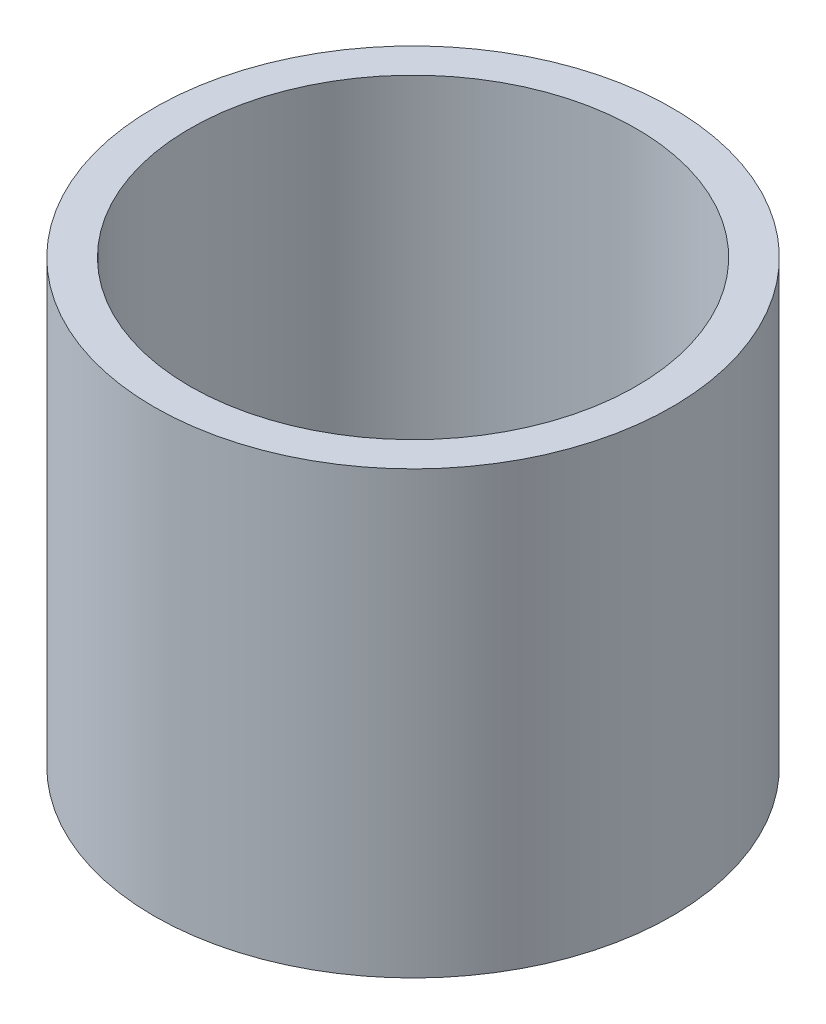
ISO-10303-21;
HEADER;
FILE_DESCRIPTION(('STEP AP214'),'2;1');
FILE_NAME('part.step','',(''),(''),'','','');
FILE_SCHEMA(('AUTOMOTIVE_DESIGN { 1 0 10303 214 1 1 1 1 }'));
ENDSEC;
DATA;
#1=APPLICATION_CONTEXT('core data for automotive mechanical design processes');
#2=APPLICATION_PROTOCOL_DEFINITION('international standard','automotive_design',2000,#1);
#3=PRODUCT_CONTEXT('',#1,'mechanical');
#4=PRODUCT('Part','Part','',(#3));
#5=PRODUCT_RELATED_PRODUCT_CATEGORY('part','',(#4));
#6=PRODUCT_DEFINITION_FORMATION('','',#4);
#7=PRODUCT_DEFINITION_CONTEXT('part definition',#1,'design');
#8=PRODUCT_DEFINITION('design','',#6,#7);
#9=PRODUCT_DEFINITION_SHAPE('','',#8);
#10=(LENGTH_UNIT() NAMED_UNIT(*) SI_UNIT(.MILLI.,.METRE.));
#11=(NAMED_UNIT(*) PLANE_ANGLE_UNIT() SI_UNIT($,.RADIAN.));
#12=(NAMED_UNIT(*) SI_UNIT($,.STERADIAN.) SOLID_ANGLE_UNIT());
#13=UNCERTAINTY_MEASURE_WITH_UNIT(LENGTH_MEASURE(1.E-05),#10,'distance_accuracy_value','');
#14=(GEOMETRIC_REPRESENTATION_CONTEXT(3) GLOBAL_UNCERTAINTY_ASSIGNED_CONTEXT((#13)) GLOBAL_UNIT_ASSIGNED_CONTEXT((#10,
#11,#12)) REPRESENTATION_CONTEXT('',''));
#15=CARTESIAN_POINT('',(0.,0.,0.));
#16=DIRECTION('',(0.,0.,1.));
#17=DIRECTION('',(1.,0.,0.));
#18=AXIS2_PLACEMENT_3D('',#15,#16,#17);
#19=CARTESIAN_POINT('',(0.,8.,0.));
#20=DIRECTION('',(0.,1.,0.));
#21=DIRECTION('',(0.,0.,1.));
#22=AXIS2_PLACEMENT_3D('',#19,#20,#21);
#23=PLANE('',#22);
#24=CARTESIAN_POINT('',(0.,8.,0.));
#25=DIRECTION('',(0.,1.,0.));
#26=DIRECTION('',(0.,0.,1.));
#27=AXIS2_PLACEMENT_3D('',#24,#25,#26);
#28=CIRCLE('',#27,4.7);
#29=CARTESIAN_POINT('',(0.,8.,4.7));
#30=VERTEX_POINT('',#29);
#31=EDGE_CURVE('E10',#30,#30,#28,.T.);
#32=ORIENTED_EDGE('',*,*,#31,.T.);
#33=EDGE_LOOP('',(#32));
#34=FACE_BOUND('',#33,.T.);
#35=CARTESIAN_POINT('',(0.,8.,0.));
#36=DIRECTION('',(0.,1.,0.));
#37=DIRECTION('',(0.,0.,1.));
#38=AXIS2_PLACEMENT_3D('',#35,#36,#37);
#39=CIRCLE('',#38,4.05);
#40=CARTESIAN_POINT('',(0.,8.,4.05));
#41=VERTEX_POINT('',#40);
#42=EDGE_CURVE('E54',#41,#41,#39,.T.);
#43=ORIENTED_EDGE('',*,*,#42,.F.);
#44=EDGE_LOOP('',(#43));
#45=FACE_BOUND('',#44,.T.);
#46=ADVANCED_FACE('F41',(#34,#45),#23,.T.);
#47=CARTESIAN_POINT('',(0.,0.,0.));
#48=DIRECTION('',(0.,1.,0.));
#49=DIRECTION('',(0.,0.,1.));
#50=AXIS2_PLACEMENT_3D('',#47,#48,#49);
#51=PLANE('',#50);
#52=CARTESIAN_POINT('',(0.,0.,0.));
#53=DIRECTION('',(0.,1.,0.));
#54=DIRECTION('',(0.,0.,1.));
#55=AXIS2_PLACEMENT_3D('',#52,#53,#54);
#56=CIRCLE('',#55,4.7);
#57=CARTESIAN_POINT('',(0.,0.,4.7));
#58=VERTEX_POINT('',#57);
#59=EDGE_CURVE('E45',#58,#58,#56,.T.);
#60=ORIENTED_EDGE('',*,*,#59,.F.);
#61=EDGE_LOOP('',(#60));
#62=FACE_BOUND('',#61,.T.);
#63=CARTESIAN_POINT('',(0.,0.,0.));
#64=DIRECTION('',(0.,1.,0.));
#65=DIRECTION('',(0.,0.,1.));
#66=AXIS2_PLACEMENT_3D('',#63,#64,#65);
#67=CIRCLE('',#66,4.05);
#68=CARTESIAN_POINT('',(0.,0.,4.05));
#69=VERTEX_POINT('',#68);
#70=EDGE_CURVE('E56',#69,#69,#67,.T.);
#71=ORIENTED_EDGE('',*,*,#70,.T.);
#72=EDGE_LOOP('',(#71));
#73=FACE_BOUND('',#72,.T.);
#74=ADVANCED_FACE('F68',(#62,#73),#51,.F.);
#75=CARTESIAN_POINT('',(0.,8.,0.));
#76=DIRECTION('',(0.,-1.,0.));
#77=DIRECTION('',(0.,0.,-1.));
#78=AXIS2_PLACEMENT_3D('',#75,#76,#77);
#79=CYLINDRICAL_SURFACE('',#78,4.7);
#80=ORIENTED_EDGE('',*,*,#31,.F.);
#81=EDGE_LOOP('',(#80));
#82=FACE_BOUND('',#81,.T.);
#83=ORIENTED_EDGE('',*,*,#59,.T.);
#84=EDGE_LOOP('',(#83));
#85=FACE_BOUND('',#84,.T.);
#86=ADVANCED_FACE('F43',(#82,#85),#79,.T.);
#87=CARTESIAN_POINT('',(0.,8.,0.));
#88=DIRECTION('',(0.,-1.,0.));
#89=DIRECTION('',(0.,0.,-1.));
#90=AXIS2_PLACEMENT_3D('',#87,#88,#89);
#91=CYLINDRICAL_SURFACE('',#90,4.05);
#92=ORIENTED_EDGE('',*,*,#42,.T.);
#93=EDGE_LOOP('',(#92));
#94=FACE_BOUND('',#93,.T.);
#95=ORIENTED_EDGE('',*,*,#70,.F.);
#96=EDGE_LOOP('',(#95));
#97=FACE_BOUND('',#96,.T.);
#98=ADVANCED_FACE('F64',(#94,#97),#91,.F.);
#99=CLOSED_SHELL('',(#46,#74,#86,#98));
#100=MANIFOLD_SOLID_BREP('B2',#99);
#101=ADVANCED_BREP_SHAPE_REPRESENTATION('',(#18,#100),#14);
#102=SHAPE_DEFINITION_REPRESENTATION(#9,#101);
ENDSEC;
END-ISO-10303-21;
